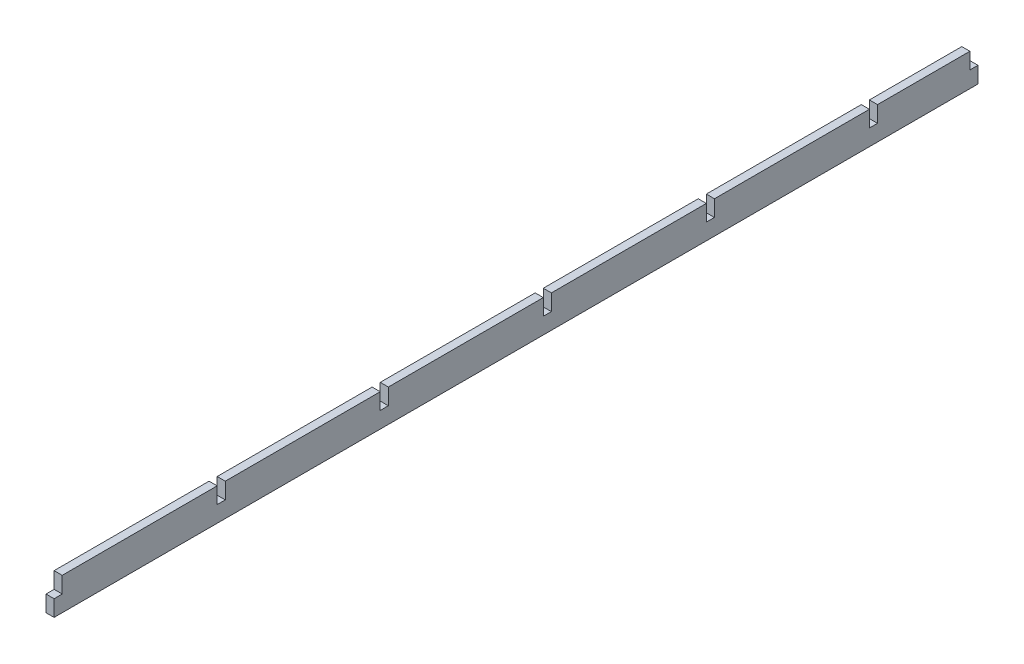
ISO-10303-21;
HEADER;
FILE_DESCRIPTION(('STEP AP214'),'2;1');
FILE_NAME('part.step','',(''),(''),'','','');
FILE_SCHEMA(('AUTOMOTIVE_DESIGN { 1 0 10303 214 1 1 1 1 }'));
ENDSEC;
DATA;
#1=APPLICATION_CONTEXT('core data for automotive mechanical design processes');
#2=APPLICATION_PROTOCOL_DEFINITION('international standard','automotive_design',2000,#1);
#3=PRODUCT_CONTEXT('',#1,'mechanical');
#4=PRODUCT('Part','Part','',(#3));
#5=PRODUCT_RELATED_PRODUCT_CATEGORY('part','',(#4));
#6=PRODUCT_DEFINITION_FORMATION('','',#4);
#7=PRODUCT_DEFINITION_CONTEXT('part definition',#1,'design');
#8=PRODUCT_DEFINITION('design','',#6,#7);
#9=PRODUCT_DEFINITION_SHAPE('','',#8);
#10=(LENGTH_UNIT() NAMED_UNIT(*) SI_UNIT(.MILLI.,.METRE.));
#11=(NAMED_UNIT(*) PLANE_ANGLE_UNIT() SI_UNIT($,.RADIAN.));
#12=(NAMED_UNIT(*) SI_UNIT($,.STERADIAN.) SOLID_ANGLE_UNIT());
#13=UNCERTAINTY_MEASURE_WITH_UNIT(LENGTH_MEASURE(1.E-05),#10,'distance_accuracy_value','');
#14=(GEOMETRIC_REPRESENTATION_CONTEXT(3) GLOBAL_UNCERTAINTY_ASSIGNED_CONTEXT((#13)) GLOBAL_UNIT_ASSIGNED_CONTEXT((#10,
#11,#12)) REPRESENTATION_CONTEXT('',''));
#15=CARTESIAN_POINT('',(0.,0.,0.));
#16=DIRECTION('',(0.,0.,1.));
#17=DIRECTION('',(1.,0.,0.));
#18=AXIS2_PLACEMENT_3D('',#15,#16,#17);
#19=CARTESIAN_POINT('',(3.175,12.7,0.));
#20=DIRECTION('',(0.,-1.,0.));
#21=DIRECTION('',(0.,0.,-1.));
#22=AXIS2_PLACEMENT_3D('',#19,#20,#21);
#23=PLANE('',#22);
#24=DIRECTION('',(0.,0.,1.));
#25=VECTOR('',#24,1.);
#26=CARTESIAN_POINT('',(3.175,12.7,0.));
#27=LINE('',#26,#25);
#28=CARTESIAN_POINT('',(3.175,12.7,-319.405));
#29=VERTEX_POINT('',#28);
#30=CARTESIAN_POINT('',(3.175,12.7,-258.699));
#31=VERTEX_POINT('',#30);
#32=EDGE_CURVE('E323',#29,#31,#27,.T.);
#33=ORIENTED_EDGE('',*,*,#32,.F.);
#34=DIRECTION('',(1.,0.,0.));
#35=VECTOR('',#34,1.);
#36=CARTESIAN_POINT('',(-2.54,12.7,-319.405));
#37=LINE('',#36,#35);
#38=CARTESIAN_POINT('',(0.,12.7,-319.405));
#39=VERTEX_POINT('',#38);
#40=EDGE_CURVE('E312',#39,#29,#37,.T.);
#41=ORIENTED_EDGE('',*,*,#40,.F.);
#42=DIRECTION('',(0.,0.,1.));
#43=VECTOR('',#42,1.);
#44=CARTESIAN_POINT('',(0.,12.7,0.));
#45=LINE('',#44,#43);
#46=CARTESIAN_POINT('',(0.,12.7,-258.699));
#47=VERTEX_POINT('',#46);
#48=EDGE_CURVE('E242',#39,#47,#45,.T.);
#49=ORIENTED_EDGE('',*,*,#48,.T.);
#50=DIRECTION('',(1.,0.,0.));
#51=VECTOR('',#50,1.);
#52=CARTESIAN_POINT('',(-2.54,12.7,-258.699));
#53=LINE('',#52,#51);
#54=EDGE_CURVE('E484',#47,#31,#53,.T.);
#55=ORIENTED_EDGE('',*,*,#54,.T.);
#56=EDGE_LOOP('',(#33,#41,#49,#55));
#57=FACE_BOUND('',#56,.T.);
#58=ADVANCED_FACE('F33',(#57),#23,.F.);
#59=CARTESIAN_POINT('',(3.175,12.7,-255.524));
#60=VERTEX_POINT('',#59);
#61=CARTESIAN_POINT('',(3.175,12.7,-194.818));
#62=VERTEX_POINT('',#61);
#63=EDGE_CURVE('E405',#60,#62,#27,.T.);
#64=ORIENTED_EDGE('',*,*,#63,.F.);
#65=DIRECTION('',(1.,0.,0.));
#66=VECTOR('',#65,1.);
#67=CARTESIAN_POINT('',(-2.54,12.7,-255.524));
#68=LINE('',#67,#66);
#69=CARTESIAN_POINT('',(0.,12.7,-255.524));
#70=VERTEX_POINT('',#69);
#71=EDGE_CURVE('E446',#70,#60,#68,.T.);
#72=ORIENTED_EDGE('',*,*,#71,.F.);
#73=CARTESIAN_POINT('',(0.,12.7,-194.818));
#74=VERTEX_POINT('',#73);
#75=EDGE_CURVE('E331',#70,#74,#45,.T.);
#76=ORIENTED_EDGE('',*,*,#75,.T.);
#77=DIRECTION('',(1.,0.,0.));
#78=VECTOR('',#77,1.);
#79=CARTESIAN_POINT('',(-2.54,12.7,-194.818));
#80=LINE('',#79,#78);
#81=EDGE_CURVE('E429',#74,#62,#80,.T.);
#82=ORIENTED_EDGE('',*,*,#81,.T.);
#83=EDGE_LOOP('',(#64,#72,#76,#82));
#84=FACE_BOUND('',#83,.T.);
#85=ADVANCED_FACE('F511',(#84),#23,.F.);
#86=CARTESIAN_POINT('',(0.,12.7,-63.881));
#87=VERTEX_POINT('',#86);
#88=CARTESIAN_POINT('',(0.,12.7,-3.175));
#89=VERTEX_POINT('',#88);
#90=EDGE_CURVE('E244',#87,#89,#45,.T.);
#91=ORIENTED_EDGE('',*,*,#90,.T.);
#92=DIRECTION('',(1.,0.,0.));
#93=VECTOR('',#92,1.);
#94=CARTESIAN_POINT('',(-2.54,12.7,-3.175));
#95=LINE('',#94,#93);
#96=CARTESIAN_POINT('',(3.175,12.7,-3.175));
#97=VERTEX_POINT('',#96);
#98=EDGE_CURVE('E258',#89,#97,#95,.T.);
#99=ORIENTED_EDGE('',*,*,#98,.T.);
#100=CARTESIAN_POINT('',(3.175,12.7,-63.881));
#101=VERTEX_POINT('',#100);
#102=EDGE_CURVE('E251',#101,#97,#27,.T.);
#103=ORIENTED_EDGE('',*,*,#102,.F.);
#104=DIRECTION('',(1.,0.,0.));
#105=VECTOR('',#104,1.);
#106=CARTESIAN_POINT('',(-2.54,12.7,-63.881));
#107=LINE('',#106,#105);
#108=EDGE_CURVE('E231',#87,#101,#107,.T.);
#109=ORIENTED_EDGE('',*,*,#108,.F.);
#110=EDGE_LOOP('',(#91,#99,#103,#109));
#111=FACE_BOUND('',#110,.T.);
#112=ADVANCED_FACE('F468',(#111),#23,.F.);
#113=CARTESIAN_POINT('',(0.,12.7,-127.762));
#114=VERTEX_POINT('',#113);
#115=CARTESIAN_POINT('',(0.,12.7,-67.056));
#116=VERTEX_POINT('',#115);
#117=EDGE_CURVE('E264',#114,#116,#45,.T.);
#118=ORIENTED_EDGE('',*,*,#117,.T.);
#119=DIRECTION('',(1.,0.,0.));
#120=VECTOR('',#119,1.);
#121=CARTESIAN_POINT('',(-2.54,12.7,-67.056));
#122=LINE('',#121,#120);
#123=CARTESIAN_POINT('',(3.175,12.7,-67.056));
#124=VERTEX_POINT('',#123);
#125=EDGE_CURVE('E350',#116,#124,#122,.T.);
#126=ORIENTED_EDGE('',*,*,#125,.T.);
#127=CARTESIAN_POINT('',(3.175,12.7,-127.762));
#128=VERTEX_POINT('',#127);
#129=EDGE_CURVE('E253',#128,#124,#27,.T.);
#130=ORIENTED_EDGE('',*,*,#129,.F.);
#131=DIRECTION('',(1.,0.,0.));
#132=VECTOR('',#131,1.);
#133=CARTESIAN_POINT('',(-2.54,12.7,-127.762));
#134=LINE('',#133,#132);
#135=EDGE_CURVE('E352',#114,#128,#134,.T.);
#136=ORIENTED_EDGE('',*,*,#135,.F.);
#137=EDGE_LOOP('',(#118,#126,#130,#136));
#138=FACE_BOUND('',#137,.T.);
#139=ADVANCED_FACE('F348',(#138),#23,.F.);
#140=CARTESIAN_POINT('',(0.,12.7,-191.643));
#141=VERTEX_POINT('',#140);
#142=CARTESIAN_POINT('',(0.,12.7,-130.937));
#143=VERTEX_POINT('',#142);
#144=EDGE_CURVE('E333',#141,#143,#45,.T.);
#145=ORIENTED_EDGE('',*,*,#144,.T.);
#146=DIRECTION('',(1.,0.,0.));
#147=VECTOR('',#146,1.);
#148=CARTESIAN_POINT('',(-2.54,12.7,-130.937));
#149=LINE('',#148,#147);
#150=CARTESIAN_POINT('',(3.175,12.7,-130.937));
#151=VERTEX_POINT('',#150);
#152=EDGE_CURVE('E437',#143,#151,#149,.T.);
#153=ORIENTED_EDGE('',*,*,#152,.T.);
#154=CARTESIAN_POINT('',(3.175,12.7,-191.643));
#155=VERTEX_POINT('',#154);
#156=EDGE_CURVE('E408',#155,#151,#27,.T.);
#157=ORIENTED_EDGE('',*,*,#156,.F.);
#158=DIRECTION('',(1.,0.,0.));
#159=VECTOR('',#158,1.);
#160=CARTESIAN_POINT('',(-2.54,12.7,-191.643));
#161=LINE('',#160,#159);
#162=EDGE_CURVE('E425',#141,#155,#161,.T.);
#163=ORIENTED_EDGE('',*,*,#162,.F.);
#164=EDGE_LOOP('',(#145,#153,#157,#163));
#165=FACE_BOUND('',#164,.T.);
#166=ADVANCED_FACE('F519',(#165),#23,.F.);
#167=CARTESIAN_POINT('',(3.175,0.,0.));
#168=DIRECTION('',(0.,0.,-1.));
#169=DIRECTION('',(-1.,0.,0.));
#170=AXIS2_PLACEMENT_3D('',#167,#168,#169);
#171=PLANE('',#170);
#172=DIRECTION('',(0.,-1.,0.));
#173=VECTOR('',#172,1.);
#174=CARTESIAN_POINT('',(3.175,0.,0.));
#175=LINE('',#174,#173);
#176=CARTESIAN_POINT('',(3.175,6.35,0.));
#177=VERTEX_POINT('',#176);
#178=CARTESIAN_POINT('',(3.175,0.,0.));
#179=VERTEX_POINT('',#178);
#180=EDGE_CURVE('E229',#177,#179,#175,.T.);
#181=ORIENTED_EDGE('',*,*,#180,.F.);
#182=DIRECTION('',(1.,0.,0.));
#183=VECTOR('',#182,1.);
#184=CARTESIAN_POINT('',(-2.54,6.35,0.));
#185=LINE('',#184,#183);
#186=CARTESIAN_POINT('',(0.,6.35,0.));
#187=VERTEX_POINT('',#186);
#188=EDGE_CURVE('E215',#187,#177,#185,.T.);
#189=ORIENTED_EDGE('',*,*,#188,.F.);
#190=DIRECTION('',(0.,-1.,0.));
#191=VECTOR('',#190,1.);
#192=CARTESIAN_POINT('',(0.,0.,0.));
#193=LINE('',#192,#191);
#194=CARTESIAN_POINT('',(0.,0.,0.));
#195=VERTEX_POINT('',#194);
#196=EDGE_CURVE('E255',#187,#195,#193,.T.);
#197=ORIENTED_EDGE('',*,*,#196,.T.);
#198=DIRECTION('',(-1.,0.,0.));
#199=VECTOR('',#198,1.);
#200=CARTESIAN_POINT('',(3.175,0.,0.));
#201=LINE('',#200,#199);
#202=EDGE_CURVE('E235',#179,#195,#201,.T.);
#203=ORIENTED_EDGE('',*,*,#202,.F.);
#204=EDGE_LOOP('',(#181,#189,#197,#203));
#205=FACE_BOUND('',#204,.T.);
#206=ADVANCED_FACE('F35',(#205),#171,.F.);
#207=CARTESIAN_POINT('',(3.175,0.,0.));
#208=DIRECTION('',(0.,1.,0.));
#209=DIRECTION('',(0.,0.,1.));
#210=AXIS2_PLACEMENT_3D('',#207,#208,#209);
#211=PLANE('',#210);
#212=DIRECTION('',(0.,0.,-1.));
#213=VECTOR('',#212,1.);
#214=CARTESIAN_POINT('',(0.,0.,0.));
#215=LINE('',#214,#213);
#216=CARTESIAN_POINT('',(0.,0.,-361.95));
#217=VERTEX_POINT('',#216);
#218=EDGE_CURVE('E257',#195,#217,#215,.T.);
#219=ORIENTED_EDGE('',*,*,#218,.T.);
#220=DIRECTION('',(-1.,0.,0.));
#221=VECTOR('',#220,1.);
#222=CARTESIAN_POINT('',(3.175,0.,-361.95));
#223=LINE('',#222,#221);
#224=CARTESIAN_POINT('',(3.175,0.,-361.95));
#225=VERTEX_POINT('',#224);
#226=EDGE_CURVE('E265',#225,#217,#223,.T.);
#227=ORIENTED_EDGE('',*,*,#226,.F.);
#228=DIRECTION('',(0.,0.,-1.));
#229=VECTOR('',#228,1.);
#230=CARTESIAN_POINT('',(3.175,0.,0.));
#231=LINE('',#230,#229);
#232=EDGE_CURVE('E236',#179,#225,#231,.T.);
#233=ORIENTED_EDGE('',*,*,#232,.F.);
#234=ORIENTED_EDGE('',*,*,#202,.T.);
#235=EDGE_LOOP('',(#219,#227,#233,#234));
#236=FACE_BOUND('',#235,.T.);
#237=ADVANCED_FACE('F525',(#236),#211,.F.);
#238=CARTESIAN_POINT('',(3.175,0.,-361.95));
#239=DIRECTION('',(0.,0.,1.));
#240=DIRECTION('',(1.,0.,0.));
#241=AXIS2_PLACEMENT_3D('',#238,#239,#240);
#242=PLANE('',#241);
#243=DIRECTION('',(0.,1.,0.));
#244=VECTOR('',#243,1.);
#245=CARTESIAN_POINT('',(0.,0.,-361.95));
#246=LINE('',#245,#244);
#247=CARTESIAN_POINT('',(0.,6.35,-361.95));
#248=VERTEX_POINT('',#247);
#249=EDGE_CURVE('E260',#217,#248,#246,.T.);
#250=ORIENTED_EDGE('',*,*,#249,.T.);
#251=DIRECTION('',(1.,0.,0.));
#252=VECTOR('',#251,1.);
#253=CARTESIAN_POINT('',(-2.54,6.35,-361.95));
#254=LINE('',#253,#252);
#255=CARTESIAN_POINT('',(3.175,6.35,-361.95));
#256=VERTEX_POINT('',#255);
#257=EDGE_CURVE('E378',#248,#256,#254,.T.);
#258=ORIENTED_EDGE('',*,*,#257,.T.);
#259=DIRECTION('',(0.,1.,0.));
#260=VECTOR('',#259,1.);
#261=CARTESIAN_POINT('',(3.175,0.,-361.95));
#262=LINE('',#261,#260);
#263=EDGE_CURVE('E239',#225,#256,#262,.T.);
#264=ORIENTED_EDGE('',*,*,#263,.F.);
#265=ORIENTED_EDGE('',*,*,#226,.T.);
#266=EDGE_LOOP('',(#250,#258,#264,#265));
#267=FACE_BOUND('',#266,.T.);
#268=ADVANCED_FACE('F395',(#267),#242,.F.);
#269=CARTESIAN_POINT('',(0.,12.7,-358.775));
#270=VERTEX_POINT('',#269);
#271=CARTESIAN_POINT('',(0.,12.7,-322.58));
#272=VERTEX_POINT('',#271);
#273=EDGE_CURVE('E237',#270,#272,#45,.T.);
#274=ORIENTED_EDGE('',*,*,#273,.T.);
#275=DIRECTION('',(1.,0.,0.));
#276=VECTOR('',#275,1.);
#277=CARTESIAN_POINT('',(-2.54,12.7,-322.58));
#278=LINE('',#277,#276);
#279=CARTESIAN_POINT('',(3.175,12.7,-322.58));
#280=VERTEX_POINT('',#279);
#281=EDGE_CURVE('E325',#272,#280,#278,.T.);
#282=ORIENTED_EDGE('',*,*,#281,.T.);
#283=CARTESIAN_POINT('',(3.175,12.7,-358.775));
#284=VERTEX_POINT('',#283);
#285=EDGE_CURVE('E254',#284,#280,#27,.T.);
#286=ORIENTED_EDGE('',*,*,#285,.F.);
#287=DIRECTION('',(1.,0.,0.));
#288=VECTOR('',#287,1.);
#289=CARTESIAN_POINT('',(-2.54,12.7,-358.775));
#290=LINE('',#289,#288);
#291=EDGE_CURVE('E376',#270,#284,#290,.T.);
#292=ORIENTED_EDGE('',*,*,#291,.F.);
#293=EDGE_LOOP('',(#274,#282,#286,#292));
#294=FACE_BOUND('',#293,.T.);
#295=ADVANCED_FACE('F402',(#294),#23,.F.);
#296=CARTESIAN_POINT('',(3.175,0.,0.));
#297=DIRECTION('',(-1.,0.,0.));
#298=DIRECTION('',(0.,0.,1.));
#299=AXIS2_PLACEMENT_3D('',#296,#297,#298);
#300=PLANE('',#299);
#301=ORIENTED_EDGE('',*,*,#102,.T.);
#302=DIRECTION('',(0.,1.,0.));
#303=VECTOR('',#302,1.);
#304=CARTESIAN_POINT('',(3.175,12.7,-3.175));
#305=LINE('',#304,#303);
#306=CARTESIAN_POINT('',(3.175,6.35,-3.175));
#307=VERTEX_POINT('',#306);
#308=EDGE_CURVE('E224',#307,#97,#305,.T.);
#309=ORIENTED_EDGE('',*,*,#308,.F.);
#310=DIRECTION('',(0.,0.,-1.));
#311=VECTOR('',#310,1.);
#312=CARTESIAN_POINT('',(3.175,6.35,0.));
#313=LINE('',#312,#311);
#314=EDGE_CURVE('E218',#177,#307,#313,.T.);
#315=ORIENTED_EDGE('',*,*,#314,.F.);
#316=ORIENTED_EDGE('',*,*,#180,.T.);
#317=ORIENTED_EDGE('',*,*,#232,.T.);
#318=ORIENTED_EDGE('',*,*,#263,.T.);
#319=DIRECTION('',(0.,0.,-1.));
#320=VECTOR('',#319,1.);
#321=CARTESIAN_POINT('',(3.175,6.35,-358.775));
#322=LINE('',#321,#320);
#323=CARTESIAN_POINT('',(3.175,6.35,-358.775));
#324=VERTEX_POINT('',#323);
#325=EDGE_CURVE('E374',#324,#256,#322,.T.);
#326=ORIENTED_EDGE('',*,*,#325,.F.);
#327=DIRECTION('',(0.,-1.,0.));
#328=VECTOR('',#327,1.);
#329=CARTESIAN_POINT('',(3.175,12.7,-358.775));
#330=LINE('',#329,#328);
#331=EDGE_CURVE('E371',#284,#324,#330,.T.);
#332=ORIENTED_EDGE('',*,*,#331,.F.);
#333=ORIENTED_EDGE('',*,*,#285,.T.);
#334=DIRECTION('',(0.,1.,0.));
#335=VECTOR('',#334,1.);
#336=CARTESIAN_POINT('',(3.175,12.7,-322.58));
#337=LINE('',#336,#335);
#338=CARTESIAN_POINT('',(3.175,6.35,-322.58));
#339=VERTEX_POINT('',#338);
#340=EDGE_CURVE('E493',#339,#280,#337,.T.);
#341=ORIENTED_EDGE('',*,*,#340,.F.);
#342=DIRECTION('',(0.,0.,-1.));
#343=VECTOR('',#342,1.);
#344=CARTESIAN_POINT('',(3.175,6.35,-319.405));
#345=LINE('',#344,#343);
#346=CARTESIAN_POINT('',(3.175,6.35,-319.405));
#347=VERTEX_POINT('',#346);
#348=EDGE_CURVE('E491',#347,#339,#345,.T.);
#349=ORIENTED_EDGE('',*,*,#348,.F.);
#350=DIRECTION('',(0.,-1.,0.));
#351=VECTOR('',#350,1.);
#352=CARTESIAN_POINT('',(3.175,12.7,-319.405));
#353=LINE('',#352,#351);
#354=EDGE_CURVE('E489',#29,#347,#353,.T.);
#355=ORIENTED_EDGE('',*,*,#354,.F.);
#356=ORIENTED_EDGE('',*,*,#32,.T.);
#357=DIRECTION('',(0.,1.,0.));
#358=VECTOR('',#357,1.);
#359=CARTESIAN_POINT('',(3.175,12.7,-258.699));
#360=LINE('',#359,#358);
#361=CARTESIAN_POINT('',(3.175,6.35,-258.699));
#362=VERTEX_POINT('',#361);
#363=EDGE_CURVE('E480',#362,#31,#360,.T.);
#364=ORIENTED_EDGE('',*,*,#363,.F.);
#365=DIRECTION('',(0.,0.,-1.));
#366=VECTOR('',#365,1.);
#367=CARTESIAN_POINT('',(3.175,6.35,-255.524));
#368=LINE('',#367,#366);
#369=CARTESIAN_POINT('',(3.175,6.35,-255.524));
#370=VERTEX_POINT('',#369);
#371=EDGE_CURVE('E477',#370,#362,#368,.T.);
#372=ORIENTED_EDGE('',*,*,#371,.F.);
#373=DIRECTION('',(0.,-1.,0.));
#374=VECTOR('',#373,1.);
#375=CARTESIAN_POINT('',(3.175,12.7,-255.524));
#376=LINE('',#375,#374);
#377=EDGE_CURVE('E324',#60,#370,#376,.T.);
#378=ORIENTED_EDGE('',*,*,#377,.F.);
#379=ORIENTED_EDGE('',*,*,#63,.T.);
#380=DIRECTION('',(0.,1.,0.));
#381=VECTOR('',#380,1.);
#382=CARTESIAN_POINT('',(3.175,12.7,-194.818));
#383=LINE('',#382,#381);
#384=CARTESIAN_POINT('',(3.175,6.35,-194.818));
#385=VERTEX_POINT('',#384);
#386=EDGE_CURVE('E449',#385,#62,#383,.T.);
#387=ORIENTED_EDGE('',*,*,#386,.F.);
#388=DIRECTION('',(0.,0.,-1.));
#389=VECTOR('',#388,1.);
#390=CARTESIAN_POINT('',(3.175,6.35,-191.643));
#391=LINE('',#390,#389);
#392=CARTESIAN_POINT('',(3.175,6.35,-191.643));
#393=VERTEX_POINT('',#392);
#394=EDGE_CURVE('E445',#393,#385,#391,.T.);
#395=ORIENTED_EDGE('',*,*,#394,.F.);
#396=DIRECTION('',(0.,-1.,0.));
#397=VECTOR('',#396,1.);
#398=CARTESIAN_POINT('',(3.175,12.7,-191.643));
#399=LINE('',#398,#397);
#400=EDGE_CURVE('E442',#155,#393,#399,.T.);
#401=ORIENTED_EDGE('',*,*,#400,.F.);
#402=ORIENTED_EDGE('',*,*,#156,.T.);
#403=DIRECTION('',(0.,1.,0.));
#404=VECTOR('',#403,1.);
#405=CARTESIAN_POINT('',(3.175,12.7,-130.937));
#406=LINE('',#405,#404);
#407=CARTESIAN_POINT('',(3.175,6.35,-130.937));
#408=VERTEX_POINT('',#407);
#409=EDGE_CURVE('E427',#408,#151,#406,.T.);
#410=ORIENTED_EDGE('',*,*,#409,.F.);
#411=DIRECTION('',(0.,0.,-1.));
#412=VECTOR('',#411,1.);
#413=CARTESIAN_POINT('',(3.175,6.35,-127.762));
#414=LINE('',#413,#412);
#415=CARTESIAN_POINT('',(3.175,6.35,-127.762));
#416=VERTEX_POINT('',#415);
#417=EDGE_CURVE('E422',#416,#408,#414,.T.);
#418=ORIENTED_EDGE('',*,*,#417,.F.);
#419=DIRECTION('',(0.,-1.,0.));
#420=VECTOR('',#419,1.);
#421=CARTESIAN_POINT('',(3.175,12.7,-127.762));
#422=LINE('',#421,#420);
#423=EDGE_CURVE('E420',#128,#416,#422,.T.);
#424=ORIENTED_EDGE('',*,*,#423,.F.);
#425=ORIENTED_EDGE('',*,*,#129,.T.);
#426=DIRECTION('',(0.,1.,0.));
#427=VECTOR('',#426,1.);
#428=CARTESIAN_POINT('',(3.175,12.7,-67.056));
#429=LINE('',#428,#427);
#430=CARTESIAN_POINT('',(3.175,6.35,-67.056));
#431=VERTEX_POINT('',#430);
#432=EDGE_CURVE('E363',#431,#124,#429,.T.);
#433=ORIENTED_EDGE('',*,*,#432,.F.);
#434=DIRECTION('',(0.,0.,-1.));
#435=VECTOR('',#434,1.);
#436=CARTESIAN_POINT('',(3.175,6.35,-63.881));
#437=LINE('',#436,#435);
#438=CARTESIAN_POINT('',(3.175,6.35,-63.881));
#439=VERTEX_POINT('',#438);
#440=EDGE_CURVE('E458',#439,#431,#437,.T.);
#441=ORIENTED_EDGE('',*,*,#440,.F.);
#442=DIRECTION('',(0.,-1.,0.));
#443=VECTOR('',#442,1.);
#444=CARTESIAN_POINT('',(3.175,12.7,-63.881));
#445=LINE('',#444,#443);
#446=EDGE_CURVE('E377',#101,#439,#445,.T.);
#447=ORIENTED_EDGE('',*,*,#446,.F.);
#448=EDGE_LOOP('',(#301,#309,#315,#316,#317,#318,#326,#332,#333,#341,#349,#355,#356,#364,#372,
#378,#379,#387,#395,#401,#402,#410,#418,#424,#425,#433,#441,#447));
#449=FACE_BOUND('',#448,.T.);
#450=ADVANCED_FACE('F228',(#449),#300,.F.);
#451=CARTESIAN_POINT('',(0.,0.,0.));
#452=DIRECTION('',(-1.,0.,0.));
#453=DIRECTION('',(0.,0.,1.));
#454=AXIS2_PLACEMENT_3D('',#451,#452,#453);
#455=PLANE('',#454);
#456=DIRECTION('',(0.,-1.,0.));
#457=VECTOR('',#456,1.);
#458=CARTESIAN_POINT('',(0.,0.,-3.175));
#459=LINE('',#458,#457);
#460=CARTESIAN_POINT('',(0.,6.35,-3.175));
#461=VERTEX_POINT('',#460);
#462=EDGE_CURVE('E11',#89,#461,#459,.T.);
#463=ORIENTED_EDGE('',*,*,#462,.F.);
#464=ORIENTED_EDGE('',*,*,#90,.F.);
#465=DIRECTION('',(0.,1.,0.));
#466=VECTOR('',#465,1.);
#467=CARTESIAN_POINT('',(0.,-1.39610545346613E-13,-63.881));
#468=LINE('',#467,#466);
#469=CARTESIAN_POINT('',(0.,6.35,-63.881));
#470=VERTEX_POINT('',#469);
#471=EDGE_CURVE('E292',#470,#87,#468,.T.);
#472=ORIENTED_EDGE('',*,*,#471,.F.);
#473=DIRECTION('',(0.,0.,1.));
#474=VECTOR('',#473,1.);
#475=CARTESIAN_POINT('',(0.,6.35,0.));
#476=LINE('',#475,#474);
#477=CARTESIAN_POINT('',(0.,6.35,-67.056));
#478=VERTEX_POINT('',#477);
#479=EDGE_CURVE('E287',#478,#470,#476,.T.);
#480=ORIENTED_EDGE('',*,*,#479,.F.);
#481=DIRECTION('',(0.,-1.,0.));
#482=VECTOR('',#481,1.);
#483=CARTESIAN_POINT('',(0.,0.,-67.056));
#484=LINE('',#483,#482);
#485=EDGE_CURVE('E289',#116,#478,#484,.T.);
#486=ORIENTED_EDGE('',*,*,#485,.F.);
#487=ORIENTED_EDGE('',*,*,#117,.F.);
#488=DIRECTION('',(0.,1.,0.));
#489=VECTOR('',#488,1.);
#490=CARTESIAN_POINT('',(0.,0.,-127.762));
#491=LINE('',#490,#489);
#492=CARTESIAN_POINT('',(0.,6.35,-127.762));
#493=VERTEX_POINT('',#492);
#494=EDGE_CURVE('E281',#493,#114,#491,.T.);
#495=ORIENTED_EDGE('',*,*,#494,.F.);
#496=DIRECTION('',(0.,0.,1.));
#497=VECTOR('',#496,1.);
#498=CARTESIAN_POINT('',(0.,6.35000000000003,0.));
#499=LINE('',#498,#497);
#500=CARTESIAN_POINT('',(0.,6.35,-130.937));
#501=VERTEX_POINT('',#500);
#502=EDGE_CURVE('E276',#501,#493,#499,.T.);
#503=ORIENTED_EDGE('',*,*,#502,.F.);
#504=DIRECTION('',(0.,-1.,0.));
#505=VECTOR('',#504,1.);
#506=CARTESIAN_POINT('',(0.,0.,-130.937));
#507=LINE('',#506,#505);
#508=EDGE_CURVE('E278',#143,#501,#507,.T.);
#509=ORIENTED_EDGE('',*,*,#508,.F.);
#510=ORIENTED_EDGE('',*,*,#144,.F.);
#511=DIRECTION('',(0.,1.,0.));
#512=VECTOR('',#511,1.);
#513=CARTESIAN_POINT('',(0.,0.,-191.643));
#514=LINE('',#513,#512);
#515=CARTESIAN_POINT('',(0.,6.35,-191.643));
#516=VERTEX_POINT('',#515);
#517=EDGE_CURVE('E274',#516,#141,#514,.T.);
#518=ORIENTED_EDGE('',*,*,#517,.F.);
#519=DIRECTION('',(0.,0.,1.));
#520=VECTOR('',#519,1.);
#521=CARTESIAN_POINT('',(0.,6.35,0.));
#522=LINE('',#521,#520);
#523=CARTESIAN_POINT('',(0.,6.35,-194.818));
#524=VERTEX_POINT('',#523);
#525=EDGE_CURVE('E269',#524,#516,#522,.T.);
#526=ORIENTED_EDGE('',*,*,#525,.F.);
#527=DIRECTION('',(0.,-1.,0.));
#528=VECTOR('',#527,1.);
#529=CARTESIAN_POINT('',(0.,0.,-194.818));
#530=LINE('',#529,#528);
#531=EDGE_CURVE('E271',#74,#524,#530,.T.);
#532=ORIENTED_EDGE('',*,*,#531,.F.);
#533=ORIENTED_EDGE('',*,*,#75,.F.);
#534=DIRECTION('',(0.,1.,0.));
#535=VECTOR('',#534,1.);
#536=CARTESIAN_POINT('',(0.,0.,-255.524));
#537=LINE('',#536,#535);
#538=CARTESIAN_POINT('',(0.,6.35,-255.524));
#539=VERTEX_POINT('',#538);
#540=EDGE_CURVE('E299',#539,#70,#537,.T.);
#541=ORIENTED_EDGE('',*,*,#540,.F.);
#542=DIRECTION('',(0.,0.,1.));
#543=VECTOR('',#542,1.);
#544=CARTESIAN_POINT('',(0.,6.35,0.));
#545=LINE('',#544,#543);
#546=CARTESIAN_POINT('',(0.,6.35,-258.699));
#547=VERTEX_POINT('',#546);
#548=EDGE_CURVE('E294',#547,#539,#545,.T.);
#549=ORIENTED_EDGE('',*,*,#548,.F.);
#550=DIRECTION('',(0.,-1.,0.));
#551=VECTOR('',#550,1.);
#552=CARTESIAN_POINT('',(0.,0.,-258.699));
#553=LINE('',#552,#551);
#554=EDGE_CURVE('E296',#47,#547,#553,.T.);
#555=ORIENTED_EDGE('',*,*,#554,.F.);
#556=ORIENTED_EDGE('',*,*,#48,.F.);
#557=DIRECTION('',(0.,1.,0.));
#558=VECTOR('',#557,1.);
#559=CARTESIAN_POINT('',(0.,0.,-319.405));
#560=LINE('',#559,#558);
#561=CARTESIAN_POINT('',(0.,6.35,-319.405));
#562=VERTEX_POINT('',#561);
#563=EDGE_CURVE('E305',#562,#39,#560,.T.);
#564=ORIENTED_EDGE('',*,*,#563,.F.);
#565=DIRECTION('',(0.,0.,1.));
#566=VECTOR('',#565,1.);
#567=CARTESIAN_POINT('',(0.,6.35,0.));
#568=LINE('',#567,#566);
#569=CARTESIAN_POINT('',(0.,6.35,-322.58));
#570=VERTEX_POINT('',#569);
#571=EDGE_CURVE('E301',#570,#562,#568,.T.);
#572=ORIENTED_EDGE('',*,*,#571,.F.);
#573=DIRECTION('',(0.,-1.,0.));
#574=VECTOR('',#573,1.);
#575=CARTESIAN_POINT('',(0.,0.,-322.58));
#576=LINE('',#575,#574);
#577=EDGE_CURVE('E303',#272,#570,#576,.T.);
#578=ORIENTED_EDGE('',*,*,#577,.F.);
#579=ORIENTED_EDGE('',*,*,#273,.F.);
#580=DIRECTION('',(0.,1.,0.));
#581=VECTOR('',#580,1.);
#582=CARTESIAN_POINT('',(0.,3.13638004456607E-12,-358.775));
#583=LINE('',#582,#581);
#584=CARTESIAN_POINT('',(0.,6.35,-358.775));
#585=VERTEX_POINT('',#584);
#586=EDGE_CURVE('E285',#585,#270,#583,.T.);
#587=ORIENTED_EDGE('',*,*,#586,.F.);
#588=DIRECTION('',(0.,0.,1.));
#589=VECTOR('',#588,1.);
#590=CARTESIAN_POINT('',(0.,6.3499999999998,0.));
#591=LINE('',#590,#589);
#592=EDGE_CURVE('E283',#248,#585,#591,.T.);
#593=ORIENTED_EDGE('',*,*,#592,.F.);
#594=ORIENTED_EDGE('',*,*,#249,.F.);
#595=ORIENTED_EDGE('',*,*,#218,.F.);
#596=ORIENTED_EDGE('',*,*,#196,.F.);
#597=DIRECTION('',(0.,0.,1.));
#598=VECTOR('',#597,1.);
#599=CARTESIAN_POINT('',(0.,6.35,0.));
#600=LINE('',#599,#598);
#601=EDGE_CURVE('E41',#461,#187,#600,.T.);
#602=ORIENTED_EDGE('',*,*,#601,.F.);
#603=EDGE_LOOP('',(#463,#464,#472,#480,#486,#487,#495,#503,#509,#510,#518,#526,#532,#533,#541,
#549,#555,#556,#564,#572,#578,#579,#587,#593,#594,#595,#596,#602));
#604=FACE_BOUND('',#603,.T.);
#605=ADVANCED_FACE('F329',(#604),#455,.T.);
#606=CARTESIAN_POINT('',(-2.54,12.7,-191.643));
#607=DIRECTION('',(0.,0.,1.));
#608=DIRECTION('',(1.,0.,0.));
#609=AXIS2_PLACEMENT_3D('',#606,#607,#608);
#610=PLANE('',#609);
#611=ORIENTED_EDGE('',*,*,#517,.T.);
#612=ORIENTED_EDGE('',*,*,#162,.T.);
#613=ORIENTED_EDGE('',*,*,#400,.T.);
#614=DIRECTION('',(1.,0.,0.));
#615=VECTOR('',#614,1.);
#616=CARTESIAN_POINT('',(-2.54,6.35,-191.643));
#617=LINE('',#616,#615);
#618=EDGE_CURVE('E450',#516,#393,#617,.T.);
#619=ORIENTED_EDGE('',*,*,#618,.F.);
#620=EDGE_LOOP('',(#611,#612,#613,#619));
#621=FACE_BOUND('',#620,.T.);
#622=ADVANCED_FACE('F581',(#621),#610,.F.);
#623=CARTESIAN_POINT('',(-2.54,12.7,-194.818));
#624=DIRECTION('',(0.,0.,-1.));
#625=DIRECTION('',(-1.,0.,0.));
#626=AXIS2_PLACEMENT_3D('',#623,#624,#625);
#627=PLANE('',#626);
#628=ORIENTED_EDGE('',*,*,#531,.T.);
#629=DIRECTION('',(1.,0.,0.));
#630=VECTOR('',#629,1.);
#631=CARTESIAN_POINT('',(-2.54,6.35,-194.818));
#632=LINE('',#631,#630);
#633=EDGE_CURVE('E453',#524,#385,#632,.T.);
#634=ORIENTED_EDGE('',*,*,#633,.T.);
#635=ORIENTED_EDGE('',*,*,#386,.T.);
#636=ORIENTED_EDGE('',*,*,#81,.F.);
#637=EDGE_LOOP('',(#628,#634,#635,#636));
#638=FACE_BOUND('',#637,.T.);
#639=ADVANCED_FACE('F589',(#638),#627,.F.);
#640=CARTESIAN_POINT('',(-2.54,6.35,-191.643));
#641=DIRECTION('',(0.,-1.,0.));
#642=DIRECTION('',(0.,0.,-1.));
#643=AXIS2_PLACEMENT_3D('',#640,#641,#642);
#644=PLANE('',#643);
#645=ORIENTED_EDGE('',*,*,#525,.T.);
#646=ORIENTED_EDGE('',*,*,#618,.T.);
#647=ORIENTED_EDGE('',*,*,#394,.T.);
#648=ORIENTED_EDGE('',*,*,#633,.F.);
#649=EDGE_LOOP('',(#645,#646,#647,#648));
#650=FACE_BOUND('',#649,.T.);
#651=ADVANCED_FACE('F599',(#650),#644,.F.);
#652=CARTESIAN_POINT('',(-2.54,12.7,-127.762));
#653=DIRECTION('',(0.,0.,1.));
#654=DIRECTION('',(1.,0.,0.));
#655=AXIS2_PLACEMENT_3D('',#652,#653,#654);
#656=PLANE('',#655);
#657=ORIENTED_EDGE('',*,*,#494,.T.);
#658=ORIENTED_EDGE('',*,*,#135,.T.);
#659=ORIENTED_EDGE('',*,*,#423,.T.);
#660=DIRECTION('',(1.,0.,0.));
#661=VECTOR('',#660,1.);
#662=CARTESIAN_POINT('',(-2.54,6.35,-127.762));
#663=LINE('',#662,#661);
#664=EDGE_CURVE('E435',#493,#416,#663,.T.);
#665=ORIENTED_EDGE('',*,*,#664,.F.);
#666=EDGE_LOOP('',(#657,#658,#659,#665));
#667=FACE_BOUND('',#666,.T.);
#668=ADVANCED_FACE('F609',(#667),#656,.F.);
#669=CARTESIAN_POINT('',(-2.54,12.7,-130.937));
#670=DIRECTION('',(0.,0.,-1.));
#671=DIRECTION('',(-1.,0.,0.));
#672=AXIS2_PLACEMENT_3D('',#669,#670,#671);
#673=PLANE('',#672);
#674=ORIENTED_EDGE('',*,*,#508,.T.);
#675=DIRECTION('',(1.,0.,0.));
#676=VECTOR('',#675,1.);
#677=CARTESIAN_POINT('',(-2.54,6.35,-130.937));
#678=LINE('',#677,#676);
#679=EDGE_CURVE('E439',#501,#408,#678,.T.);
#680=ORIENTED_EDGE('',*,*,#679,.T.);
#681=ORIENTED_EDGE('',*,*,#409,.T.);
#682=ORIENTED_EDGE('',*,*,#152,.F.);
#683=EDGE_LOOP('',(#674,#680,#681,#682));
#684=FACE_BOUND('',#683,.T.);
#685=ADVANCED_FACE('F619',(#684),#673,.F.);
#686=CARTESIAN_POINT('',(-2.54,6.35,-127.762));
#687=DIRECTION('',(0.,-1.,0.));
#688=DIRECTION('',(0.,0.,-1.));
#689=AXIS2_PLACEMENT_3D('',#686,#687,#688);
#690=PLANE('',#689);
#691=ORIENTED_EDGE('',*,*,#502,.T.);
#692=ORIENTED_EDGE('',*,*,#664,.T.);
#693=ORIENTED_EDGE('',*,*,#417,.T.);
#694=ORIENTED_EDGE('',*,*,#679,.F.);
#695=EDGE_LOOP('',(#691,#692,#693,#694));
#696=FACE_BOUND('',#695,.T.);
#697=ADVANCED_FACE('F628',(#696),#690,.F.);
#698=CARTESIAN_POINT('',(-2.54,12.7,-358.775));
#699=DIRECTION('',(0.,0.,1.));
#700=DIRECTION('',(0.,-1.,0.));
#701=AXIS2_PLACEMENT_3D('',#698,#699,#700);
#702=PLANE('',#701);
#703=ORIENTED_EDGE('',*,*,#586,.T.);
#704=ORIENTED_EDGE('',*,*,#291,.T.);
#705=ORIENTED_EDGE('',*,*,#331,.T.);
#706=DIRECTION('',(1.,0.,0.));
#707=VECTOR('',#706,1.);
#708=CARTESIAN_POINT('',(-2.54,6.35,-358.775));
#709=LINE('',#708,#707);
#710=EDGE_CURVE('E246',#585,#324,#709,.T.);
#711=ORIENTED_EDGE('',*,*,#710,.F.);
#712=EDGE_LOOP('',(#703,#704,#705,#711));
#713=FACE_BOUND('',#712,.T.);
#714=ADVANCED_FACE('F390',(#713),#702,.F.);
#715=CARTESIAN_POINT('',(-2.54,6.35,-358.775));
#716=DIRECTION('',(0.,-1.,0.));
#717=DIRECTION('',(0.,0.,-1.));
#718=AXIS2_PLACEMENT_3D('',#715,#716,#717);
#719=PLANE('',#718);
#720=ORIENTED_EDGE('',*,*,#592,.T.);
#721=ORIENTED_EDGE('',*,*,#710,.T.);
#722=ORIENTED_EDGE('',*,*,#325,.T.);
#723=ORIENTED_EDGE('',*,*,#257,.F.);
#724=EDGE_LOOP('',(#720,#721,#722,#723));
#725=FACE_BOUND('',#724,.T.);
#726=ADVANCED_FACE('F384',(#725),#719,.F.);
#727=CARTESIAN_POINT('',(-2.54,12.7,-63.881));
#728=DIRECTION('',(0.,0.,1.));
#729=DIRECTION('',(0.,-1.,0.));
#730=AXIS2_PLACEMENT_3D('',#727,#728,#729);
#731=PLANE('',#730);
#732=ORIENTED_EDGE('',*,*,#471,.T.);
#733=ORIENTED_EDGE('',*,*,#108,.T.);
#734=ORIENTED_EDGE('',*,*,#446,.T.);
#735=DIRECTION('',(1.,0.,0.));
#736=VECTOR('',#735,1.);
#737=CARTESIAN_POINT('',(-2.54,6.35,-63.881));
#738=LINE('',#737,#736);
#739=EDGE_CURVE('E366',#470,#439,#738,.T.);
#740=ORIENTED_EDGE('',*,*,#739,.F.);
#741=EDGE_LOOP('',(#732,#733,#734,#740));
#742=FACE_BOUND('',#741,.T.);
#743=ADVANCED_FACE('F655',(#742),#731,.F.);
#744=CARTESIAN_POINT('',(-2.54,12.7,-67.056));
#745=DIRECTION('',(0.,0.,-1.));
#746=DIRECTION('',(-1.,0.,0.));
#747=AXIS2_PLACEMENT_3D('',#744,#745,#746);
#748=PLANE('',#747);
#749=ORIENTED_EDGE('',*,*,#485,.T.);
#750=DIRECTION('',(1.,0.,0.));
#751=VECTOR('',#750,1.);
#752=CARTESIAN_POINT('',(-2.54,6.35,-67.056));
#753=LINE('',#752,#751);
#754=EDGE_CURVE('E360',#478,#431,#753,.T.);
#755=ORIENTED_EDGE('',*,*,#754,.T.);
#756=ORIENTED_EDGE('',*,*,#432,.T.);
#757=ORIENTED_EDGE('',*,*,#125,.F.);
#758=EDGE_LOOP('',(#749,#755,#756,#757));
#759=FACE_BOUND('',#758,.T.);
#760=ADVANCED_FACE('F359',(#759),#748,.F.);
#761=CARTESIAN_POINT('',(-2.54,6.35,-63.881));
#762=DIRECTION('',(0.,-1.,0.));
#763=DIRECTION('',(0.,0.,-1.));
#764=AXIS2_PLACEMENT_3D('',#761,#762,#763);
#765=PLANE('',#764);
#766=ORIENTED_EDGE('',*,*,#479,.T.);
#767=ORIENTED_EDGE('',*,*,#739,.T.);
#768=ORIENTED_EDGE('',*,*,#440,.T.);
#769=ORIENTED_EDGE('',*,*,#754,.F.);
#770=EDGE_LOOP('',(#766,#767,#768,#769));
#771=FACE_BOUND('',#770,.T.);
#772=ADVANCED_FACE('F460',(#771),#765,.F.);
#773=CARTESIAN_POINT('',(-2.54,12.7,-255.524));
#774=DIRECTION('',(0.,0.,1.));
#775=DIRECTION('',(1.,0.,0.));
#776=AXIS2_PLACEMENT_3D('',#773,#774,#775);
#777=PLANE('',#776);
#778=ORIENTED_EDGE('',*,*,#540,.T.);
#779=ORIENTED_EDGE('',*,*,#71,.T.);
#780=ORIENTED_EDGE('',*,*,#377,.T.);
#781=DIRECTION('',(1.,0.,0.));
#782=VECTOR('',#781,1.);
#783=CARTESIAN_POINT('',(-2.54,6.35,-255.524));
#784=LINE('',#783,#782);
#785=EDGE_CURVE('E482',#539,#370,#784,.T.);
#786=ORIENTED_EDGE('',*,*,#785,.F.);
#787=EDGE_LOOP('',(#778,#779,#780,#786));
#788=FACE_BOUND('',#787,.T.);
#789=ADVANCED_FACE('F680',(#788),#777,.F.);
#790=CARTESIAN_POINT('',(-2.54,12.7,-258.699));
#791=DIRECTION('',(0.,0.,-1.));
#792=DIRECTION('',(-1.,0.,0.));
#793=AXIS2_PLACEMENT_3D('',#790,#791,#792);
#794=PLANE('',#793);
#795=ORIENTED_EDGE('',*,*,#554,.T.);
#796=DIRECTION('',(1.,0.,0.));
#797=VECTOR('',#796,1.);
#798=CARTESIAN_POINT('',(-2.54,6.35,-258.699));
#799=LINE('',#798,#797);
#800=EDGE_CURVE('E486',#547,#362,#799,.T.);
#801=ORIENTED_EDGE('',*,*,#800,.T.);
#802=ORIENTED_EDGE('',*,*,#363,.T.);
#803=ORIENTED_EDGE('',*,*,#54,.F.);
#804=EDGE_LOOP('',(#795,#801,#802,#803));
#805=FACE_BOUND('',#804,.T.);
#806=ADVANCED_FACE('F689',(#805),#794,.F.);
#807=CARTESIAN_POINT('',(-2.54,6.35,-255.524));
#808=DIRECTION('',(0.,-1.,0.));
#809=DIRECTION('',(0.,0.,-1.));
#810=AXIS2_PLACEMENT_3D('',#807,#808,#809);
#811=PLANE('',#810);
#812=ORIENTED_EDGE('',*,*,#548,.T.);
#813=ORIENTED_EDGE('',*,*,#785,.T.);
#814=ORIENTED_EDGE('',*,*,#371,.T.);
#815=ORIENTED_EDGE('',*,*,#800,.F.);
#816=EDGE_LOOP('',(#812,#813,#814,#815));
#817=FACE_BOUND('',#816,.T.);
#818=ADVANCED_FACE('F507',(#817),#811,.F.);
#819=CARTESIAN_POINT('',(-2.54,12.7,-319.405));
#820=DIRECTION('',(0.,0.,1.));
#821=DIRECTION('',(1.,0.,0.));
#822=AXIS2_PLACEMENT_3D('',#819,#820,#821);
#823=PLANE('',#822);
#824=ORIENTED_EDGE('',*,*,#563,.T.);
#825=ORIENTED_EDGE('',*,*,#40,.T.);
#826=ORIENTED_EDGE('',*,*,#354,.T.);
#827=DIRECTION('',(1.,0.,0.));
#828=VECTOR('',#827,1.);
#829=CARTESIAN_POINT('',(-2.54,6.35,-319.405));
#830=LINE('',#829,#828);
#831=EDGE_CURVE('E314',#562,#347,#830,.T.);
#832=ORIENTED_EDGE('',*,*,#831,.F.);
#833=EDGE_LOOP('',(#824,#825,#826,#832));
#834=FACE_BOUND('',#833,.T.);
#835=ADVANCED_FACE('F310',(#834),#823,.F.);
#836=CARTESIAN_POINT('',(-2.54,12.7,-322.58));
#837=DIRECTION('',(0.,0.,-1.));
#838=DIRECTION('',(-1.,0.,0.));
#839=AXIS2_PLACEMENT_3D('',#836,#837,#838);
#840=PLANE('',#839);
#841=ORIENTED_EDGE('',*,*,#577,.T.);
#842=DIRECTION('',(1.,0.,0.));
#843=VECTOR('',#842,1.);
#844=CARTESIAN_POINT('',(-2.54,6.35,-322.58));
#845=LINE('',#844,#843);
#846=EDGE_CURVE('E55',#570,#339,#845,.T.);
#847=ORIENTED_EDGE('',*,*,#846,.T.);
#848=ORIENTED_EDGE('',*,*,#340,.T.);
#849=ORIENTED_EDGE('',*,*,#281,.F.);
#850=EDGE_LOOP('',(#841,#847,#848,#849));
#851=FACE_BOUND('',#850,.T.);
#852=ADVANCED_FACE('F498',(#851),#840,.F.);
#853=CARTESIAN_POINT('',(-2.54,6.35,-319.405));
#854=DIRECTION('',(0.,-1.,0.));
#855=DIRECTION('',(0.,0.,-1.));
#856=AXIS2_PLACEMENT_3D('',#853,#854,#855);
#857=PLANE('',#856);
#858=ORIENTED_EDGE('',*,*,#571,.T.);
#859=ORIENTED_EDGE('',*,*,#831,.T.);
#860=ORIENTED_EDGE('',*,*,#348,.T.);
#861=ORIENTED_EDGE('',*,*,#846,.F.);
#862=EDGE_LOOP('',(#858,#859,#860,#861));
#863=FACE_BOUND('',#862,.T.);
#864=ADVANCED_FACE('F496',(#863),#857,.F.);
#865=CARTESIAN_POINT('',(-2.54,12.7,-3.175));
#866=DIRECTION('',(0.,0.,-1.));
#867=DIRECTION('',(0.,1.,0.));
#868=AXIS2_PLACEMENT_3D('',#865,#866,#867);
#869=PLANE('',#868);
#870=ORIENTED_EDGE('',*,*,#462,.T.);
#871=DIRECTION('',(1.,0.,0.));
#872=VECTOR('',#871,1.);
#873=CARTESIAN_POINT('',(-2.54,6.35,-3.175));
#874=LINE('',#873,#872);
#875=EDGE_CURVE('E48',#461,#307,#874,.T.);
#876=ORIENTED_EDGE('',*,*,#875,.T.);
#877=ORIENTED_EDGE('',*,*,#308,.T.);
#878=ORIENTED_EDGE('',*,*,#98,.F.);
#879=EDGE_LOOP('',(#870,#876,#877,#878));
#880=FACE_BOUND('',#879,.T.);
#881=ADVANCED_FACE('F505',(#880),#869,.F.);
#882=CARTESIAN_POINT('',(-2.54,6.35,0.));
#883=DIRECTION('',(0.,-1.,0.));
#884=DIRECTION('',(0.,0.,-1.));
#885=AXIS2_PLACEMENT_3D('',#882,#883,#884);
#886=PLANE('',#885);
#887=ORIENTED_EDGE('',*,*,#601,.T.);
#888=ORIENTED_EDGE('',*,*,#188,.T.);
#889=ORIENTED_EDGE('',*,*,#314,.T.);
#890=ORIENTED_EDGE('',*,*,#875,.F.);
#891=EDGE_LOOP('',(#887,#888,#889,#890));
#892=FACE_BOUND('',#891,.T.);
#893=ADVANCED_FACE('F217',(#892),#886,.F.);
#894=CLOSED_SHELL('',(#58,#85,#112,#139,#166,#206,#237,#268,#295,#450,#605,#622,#639,#651,#668,
#685,#697,#714,#726,#743,#760,#772,#789,#806,#818,#835,#852,#864,#881,#893));
#895=MANIFOLD_SOLID_BREP('B2',#894);
#896=ADVANCED_BREP_SHAPE_REPRESENTATION('',(#18,#895),#14);
#897=SHAPE_DEFINITION_REPRESENTATION(#9,#896);
ENDSEC;
END-ISO-10303-21;
